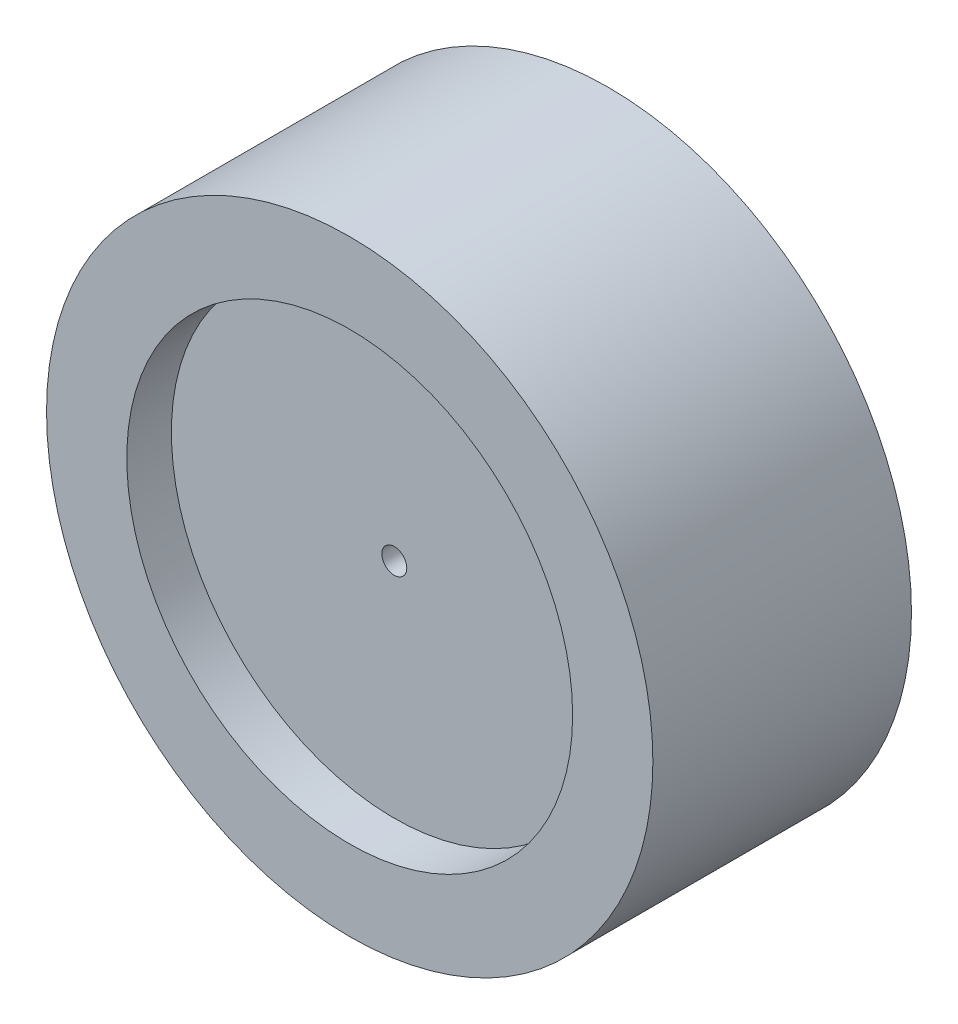
ISO-10303-21;
HEADER;
FILE_DESCRIPTION(('STEP AP214'),'2;1');
FILE_NAME('part.step','',(''),(''),'','','');
FILE_SCHEMA(('AUTOMOTIVE_DESIGN { 1 0 10303 214 1 1 1 1 }'));
ENDSEC;
DATA;
#1=APPLICATION_CONTEXT('core data for automotive mechanical design processes');
#2=APPLICATION_PROTOCOL_DEFINITION('international standard','automotive_design',2000,#1);
#3=PRODUCT_CONTEXT('',#1,'mechanical');
#4=PRODUCT('Part','Part','',(#3));
#5=PRODUCT_RELATED_PRODUCT_CATEGORY('part','',(#4));
#6=PRODUCT_DEFINITION_FORMATION('','',#4);
#7=PRODUCT_DEFINITION_CONTEXT('part definition',#1,'design');
#8=PRODUCT_DEFINITION('design','',#6,#7);
#9=PRODUCT_DEFINITION_SHAPE('','',#8);
#10=(LENGTH_UNIT() NAMED_UNIT(*) SI_UNIT(.MILLI.,.METRE.));
#11=(NAMED_UNIT(*) PLANE_ANGLE_UNIT() SI_UNIT($,.RADIAN.));
#12=(NAMED_UNIT(*) SI_UNIT($,.STERADIAN.) SOLID_ANGLE_UNIT());
#13=UNCERTAINTY_MEASURE_WITH_UNIT(LENGTH_MEASURE(1.E-05),#10,'distance_accuracy_value','');
#14=(GEOMETRIC_REPRESENTATION_CONTEXT(3) GLOBAL_UNCERTAINTY_ASSIGNED_CONTEXT((#13)) GLOBAL_UNIT_ASSIGNED_CONTEXT((#10,
#11,#12)) REPRESENTATION_CONTEXT('',''));
#15=CARTESIAN_POINT('',(0.,0.,0.));
#16=DIRECTION('',(0.,0.,1.));
#17=DIRECTION('',(1.,0.,0.));
#18=AXIS2_PLACEMENT_3D('',#15,#16,#17);
#19=CARTESIAN_POINT('',(0.,0.,29.));
#20=DIRECTION('',(0.,0.,-1.));
#21=DIRECTION('',(-1.,0.,0.));
#22=AXIS2_PLACEMENT_3D('',#19,#20,#21);
#23=CYLINDRICAL_SURFACE('',#22,34.);
#24=CARTESIAN_POINT('',(0.,0.,29.));
#25=DIRECTION('',(0.,0.,1.));
#26=DIRECTION('',(1.,0.,0.));
#27=AXIS2_PLACEMENT_3D('',#24,#25,#26);
#28=CIRCLE('',#27,34.);
#29=CARTESIAN_POINT('',(-34.,0.,29.));
#30=VERTEX_POINT('',#29);
#31=EDGE_CURVE('E11',#30,#30,#28,.T.);
#32=CARTESIAN_POINT('',(0.,0.,0.));
#33=DIRECTION('',(0.,0.,1.));
#34=DIRECTION('',(1.,0.,0.));
#35=AXIS2_PLACEMENT_3D('',#32,#33,#34);
#36=CIRCLE('',#35,34.);
#37=CARTESIAN_POINT('',(-34.,0.,0.));
#38=VERTEX_POINT('',#37);
#39=EDGE_CURVE('E49',#38,#38,#36,.T.);
#40=CARTESIAN_POINT('',(-34.,0.,29.));
#41=CARTESIAN_POINT('',(-34.,0.,28.6979166666667));
#42=CARTESIAN_POINT('',(-34.,0.,28.3958333333333));
#43=CARTESIAN_POINT('',(-34.,0.,27.7916666666667));
#44=CARTESIAN_POINT('',(-34.,0.,27.4895833333333));
#45=CARTESIAN_POINT('',(-34.,0.,26.8854166666667));
#46=CARTESIAN_POINT('',(-34.,0.,26.5833333333333));
#47=CARTESIAN_POINT('',(-34.,0.,25.9791666666667));
#48=CARTESIAN_POINT('',(-34.,0.,25.6770833333333));
#49=CARTESIAN_POINT('',(-34.,0.,25.0729166666667));
#50=CARTESIAN_POINT('',(-34.,0.,24.7708333333333));
#51=CARTESIAN_POINT('',(-34.,0.,24.1666666666667));
#52=CARTESIAN_POINT('',(-34.,0.,23.8645833333333));
#53=CARTESIAN_POINT('',(-34.,0.,23.2604166666667));
#54=CARTESIAN_POINT('',(-34.,0.,22.9583333333333));
#55=CARTESIAN_POINT('',(-34.,0.,22.3541666666667));
#56=CARTESIAN_POINT('',(-34.,0.,22.0520833333333));
#57=CARTESIAN_POINT('',(-34.,0.,21.4479166666667));
#58=CARTESIAN_POINT('',(-34.,0.,21.1458333333333));
#59=CARTESIAN_POINT('',(-34.,0.,20.5416666666667));
#60=CARTESIAN_POINT('',(-34.,0.,20.2395833333333));
#61=CARTESIAN_POINT('',(-34.,0.,19.6354166666667));
#62=CARTESIAN_POINT('',(-34.,0.,19.3333333333333));
#63=CARTESIAN_POINT('',(-34.,0.,18.7291666666667));
#64=CARTESIAN_POINT('',(-34.,0.,18.4270833333333));
#65=CARTESIAN_POINT('',(-34.,0.,17.8229166666667));
#66=CARTESIAN_POINT('',(-34.,0.,17.5208333333333));
#67=CARTESIAN_POINT('',(-34.,0.,16.9166666666667));
#68=CARTESIAN_POINT('',(-34.,0.,16.6145833333333));
#69=CARTESIAN_POINT('',(-34.,0.,16.0104166666667));
#70=CARTESIAN_POINT('',(-34.,0.,15.7083333333333));
#71=CARTESIAN_POINT('',(-34.,0.,15.1041666666667));
#72=CARTESIAN_POINT('',(-34.,0.,14.8020833333333));
#73=CARTESIAN_POINT('',(-34.,0.,14.1979166666667));
#74=CARTESIAN_POINT('',(-34.,0.,13.8958333333333));
#75=CARTESIAN_POINT('',(-34.,0.,13.2916666666667));
#76=CARTESIAN_POINT('',(-34.,0.,12.9895833333333));
#77=CARTESIAN_POINT('',(-34.,0.,12.3854166666667));
#78=CARTESIAN_POINT('',(-34.,0.,12.0833333333333));
#79=CARTESIAN_POINT('',(-34.,0.,11.4791666666667));
#80=CARTESIAN_POINT('',(-34.,0.,11.1770833333333));
#81=CARTESIAN_POINT('',(-34.,0.,10.5729166666667));
#82=CARTESIAN_POINT('',(-34.,0.,10.2708333333333));
#83=CARTESIAN_POINT('',(-34.,0.,9.66666666666667));
#84=CARTESIAN_POINT('',(-34.,0.,9.36458333333333));
#85=CARTESIAN_POINT('',(-34.,0.,8.76041666666667));
#86=CARTESIAN_POINT('',(-34.,0.,8.45833333333333));
#87=CARTESIAN_POINT('',(-34.,0.,7.85416666666667));
#88=CARTESIAN_POINT('',(-34.,0.,7.55208333333333));
#89=CARTESIAN_POINT('',(-34.,0.,6.94791666666667));
#90=CARTESIAN_POINT('',(-34.,0.,6.64583333333333));
#91=CARTESIAN_POINT('',(-34.,0.,6.04166666666667));
#92=CARTESIAN_POINT('',(-34.,0.,5.73958333333333));
#93=CARTESIAN_POINT('',(-34.,0.,5.13541666666667));
#94=CARTESIAN_POINT('',(-34.,0.,4.83333333333333));
#95=CARTESIAN_POINT('',(-34.,0.,4.22916666666667));
#96=CARTESIAN_POINT('',(-34.,0.,3.92708333333333));
#97=CARTESIAN_POINT('',(-34.,0.,3.32291666666667));
#98=CARTESIAN_POINT('',(-34.,0.,3.02083333333333));
#99=CARTESIAN_POINT('',(-34.,0.,2.41666666666667));
#100=CARTESIAN_POINT('',(-34.,0.,2.11458333333333));
#101=CARTESIAN_POINT('',(-34.,0.,1.51041666666667));
#102=CARTESIAN_POINT('',(-34.,0.,1.20833333333333));
#103=CARTESIAN_POINT('',(-34.,0.,0.604166666666667));
#104=CARTESIAN_POINT('',(-34.,0.,0.302083333333333));
#105=CARTESIAN_POINT('',(-34.,0.,0.));
#106=B_SPLINE_CURVE_WITH_KNOTS('',3,(#40,#41,#42,#43,#44,#45,#46,#47,#48,#49,#50,#51,#52,#53,
#54,#55,#56,#57,#58,#59,#60,#61,#62,#63,#64,#65,#66,#67,#68,#69,#70,#71,#72,#73,#74,#75,#76,#77,
#78,#79,#80,#81,#82,#83,#84,#85,#86,#87,#88,#89,#90,#91,#92,#93,#94,#95,#96,#97,#98,#99,#100,
#101,#102,#103,#104,#105),.UNSPECIFIED.,.F.,.F.,(4,2,2,2,2,2,2,2,2,2,2,2,2,2,2,2,2,2,2,2,2,2,2,
2,2,2,2,2,2,2,2,2,4),(0.,0.906249999999997,1.8125,2.71875,3.625,4.53125,5.4375,6.34375,7.25,
8.15625,9.0625,9.96875,10.875,11.78125,12.6875,13.59375,14.5,15.40625,16.3125,17.21875,18.125,
19.03125,19.9375,20.84375,21.75,22.65625,23.5625,24.46875,25.375,26.28125,27.1875,28.09375,29.),.UNSPECIFIED.);
#107=EDGE_CURVE('BSEAM40',#30,#38,#106,.T.);
#108=ORIENTED_EDGE('',*,*,#31,.F.);
#109=ORIENTED_EDGE('',*,*,#39,.T.);
#110=ORIENTED_EDGE('',*,*,#107,.T.);
#111=ORIENTED_EDGE('',*,*,#107,.F.);
#112=EDGE_LOOP('',(#108,#110,#109,#111));
#113=FACE_BOUND('',#112,.T.);
#114=ADVANCED_FACE('F40',(#113),#23,.T.);
#115=CARTESIAN_POINT('',(0.,0.,29.));
#116=DIRECTION('',(0.,0.,1.));
#117=DIRECTION('',(1.,0.,0.));
#118=AXIS2_PLACEMENT_3D('',#115,#116,#117);
#119=PLANE('',#118);
#120=CARTESIAN_POINT('',(0.,0.,29.));
#121=DIRECTION('',(0.,0.,1.));
#122=DIRECTION('',(1.,0.,0.));
#123=AXIS2_PLACEMENT_3D('',#120,#121,#122);
#124=CIRCLE('',#123,25.);
#125=CARTESIAN_POINT('',(25.,0.,29.));
#126=VERTEX_POINT('',#125);
#127=EDGE_CURVE('E170',#126,#126,#124,.T.);
#128=ORIENTED_EDGE('',*,*,#127,.F.);
#129=EDGE_LOOP('',(#128));
#130=FACE_BOUND('',#129,.T.);
#131=ORIENTED_EDGE('',*,*,#31,.T.);
#132=EDGE_LOOP('',(#131));
#133=FACE_BOUND('',#132,.T.);
#134=ADVANCED_FACE('F190',(#130,#133),#119,.T.);
#135=CARTESIAN_POINT('',(0.,0.,0.));
#136=DIRECTION('',(0.,0.,1.));
#137=DIRECTION('',(1.,0.,0.));
#138=AXIS2_PLACEMENT_3D('',#135,#136,#137);
#139=PLANE('',#138);
#140=CARTESIAN_POINT('',(0.,0.,0.));
#141=DIRECTION('',(0.,0.,-1.));
#142=DIRECTION('',(-1.,0.,0.));
#143=AXIS2_PLACEMENT_3D('',#140,#141,#142);
#144=CIRCLE('',#143,25.);
#145=CARTESIAN_POINT('',(-25.,0.,0.));
#146=VERTEX_POINT('',#145);
#147=EDGE_CURVE('E156',#146,#146,#144,.T.);
#148=ORIENTED_EDGE('',*,*,#147,.F.);
#149=EDGE_LOOP('',(#148));
#150=FACE_BOUND('',#149,.T.);
#151=ORIENTED_EDGE('',*,*,#39,.F.);
#152=EDGE_LOOP('',(#151));
#153=FACE_BOUND('',#152,.T.);
#154=ADVANCED_FACE('F187',(#150,#153),#139,.F.);
#155=CARTESIAN_POINT('',(0.,0.,24.));
#156=DIRECTION('',(0.,0.,1.));
#157=DIRECTION('',(1.,0.,0.));
#158=AXIS2_PLACEMENT_3D('',#155,#156,#157);
#159=CYLINDRICAL_SURFACE('',#158,25.);
#160=CARTESIAN_POINT('',(0.,0.,24.));
#161=DIRECTION('',(0.,0.,1.));
#162=DIRECTION('',(1.,0.,0.));
#163=AXIS2_PLACEMENT_3D('',#160,#161,#162);
#164=CIRCLE('',#163,25.);
#165=CARTESIAN_POINT('',(25.,0.,24.));
#166=VERTEX_POINT('',#165);
#167=EDGE_CURVE('E174',#166,#166,#164,.T.);
#168=ORIENTED_EDGE('',*,*,#167,.F.);
#169=EDGE_LOOP('',(#168));
#170=FACE_BOUND('',#169,.T.);
#171=ORIENTED_EDGE('',*,*,#127,.T.);
#172=EDGE_LOOP('',(#171));
#173=FACE_BOUND('',#172,.T.);
#174=ADVANCED_FACE('F189',(#170,#173),#159,.F.);
#175=CARTESIAN_POINT('',(0.,0.,24.));
#176=DIRECTION('',(0.,0.,1.));
#177=DIRECTION('',(1.,0.,0.));
#178=AXIS2_PLACEMENT_3D('',#175,#176,#177);
#179=PLANE('',#178);
#180=CARTESIAN_POINT('',(0.,0.,24.));
#181=DIRECTION('',(0.,0.,1.));
#182=DIRECTION('',(1.,0.,0.));
#183=AXIS2_PLACEMENT_3D('',#180,#181,#182);
#184=CIRCLE('',#183,1.4);
#185=CARTESIAN_POINT('',(1.4,0.,24.));
#186=VERTEX_POINT('',#185);
#187=EDGE_CURVE('E380',#186,#186,#184,.T.);
#188=ORIENTED_EDGE('',*,*,#187,.F.);
#189=EDGE_LOOP('',(#188));
#190=FACE_BOUND('',#189,.T.);
#191=ORIENTED_EDGE('',*,*,#167,.T.);
#192=EDGE_LOOP('',(#191));
#193=FACE_BOUND('',#192,.T.);
#194=ADVANCED_FACE('F196',(#190,#193),#179,.T.);
#195=CARTESIAN_POINT('',(0.,0.,5.));
#196=DIRECTION('',(0.,0.,-1.));
#197=DIRECTION('',(-1.,0.,0.));
#198=AXIS2_PLACEMENT_3D('',#195,#196,#197);
#199=CYLINDRICAL_SURFACE('',#198,25.);
#200=CARTESIAN_POINT('',(0.,0.,5.));
#201=DIRECTION('',(0.,0.,-1.));
#202=DIRECTION('',(-1.,0.,0.));
#203=AXIS2_PLACEMENT_3D('',#200,#201,#202);
#204=CIRCLE('',#203,25.);
#205=CARTESIAN_POINT('',(-25.,0.,5.));
#206=VERTEX_POINT('',#205);
#207=EDGE_CURVE('E166',#206,#206,#204,.T.);
#208=ORIENTED_EDGE('',*,*,#207,.F.);
#209=EDGE_LOOP('',(#208));
#210=FACE_BOUND('',#209,.T.);
#211=ORIENTED_EDGE('',*,*,#147,.T.);
#212=EDGE_LOOP('',(#211));
#213=FACE_BOUND('',#212,.T.);
#214=ADVANCED_FACE('F227',(#210,#213),#199,.F.);
#215=CARTESIAN_POINT('',(0.,0.,5.));
#216=DIRECTION('',(0.,0.,-1.));
#217=DIRECTION('',(-1.,0.,0.));
#218=AXIS2_PLACEMENT_3D('',#215,#216,#217);
#219=PLANE('',#218);
#220=DIRECTION('',(-0.992926916210415,0.118727162287643,0.));
#221=VECTOR('',#220,1.);
#222=CARTESIAN_POINT('',(1.54543416424502,-3.60901185607884,5.));
#223=LINE('',#222,#221);
#224=CARTESIAN_POINT('',(1.54543416424502,-3.60901185607884,5.));
#225=VERTEX_POINT('',#224);
#226=CARTESIAN_POINT('',(-2.35277886780099,-3.14289117415198,5.));
#227=VERTEX_POINT('',#226);
#228=EDGE_CURVE('E57',#225,#227,#223,.T.);
#229=ORIENTED_EDGE('',*,*,#228,.F.);
#230=DIRECTION('',(-0.599284196765544,-0.800536352395741,0.));
#231=VECTOR('',#230,1.);
#232=CARTESIAN_POINT('',(3.89821303204601,-0.466120681926858,5.));
#233=LINE('',#232,#231);
#234=CARTESIAN_POINT('',(3.89821303204601,-0.466120681926858,5.));
#235=VERTEX_POINT('',#234);
#236=EDGE_CURVE('E151',#235,#225,#233,.T.);
#237=ORIENTED_EDGE('',*,*,#236,.F.);
#238=DIRECTION('',(0.393642719444871,-0.919263514683383,0.));
#239=VECTOR('',#238,1.);
#240=CARTESIAN_POINT('',(2.35277886780099,3.14289117415198,5.));
#241=LINE('',#240,#239);
#242=CARTESIAN_POINT('',(2.35277886780099,3.14289117415198,5.));
#243=VERTEX_POINT('',#242);
#244=EDGE_CURVE('E148',#243,#235,#241,.T.);
#245=ORIENTED_EDGE('',*,*,#244,.F.);
#246=DIRECTION('',(0.992926916210415,-0.118727162287643,0.));
#247=VECTOR('',#246,1.);
#248=CARTESIAN_POINT('',(-1.54543416424502,3.60901185607884,5.));
#249=LINE('',#248,#247);
#250=CARTESIAN_POINT('',(-1.54543416424502,3.60901185607884,5.));
#251=VERTEX_POINT('',#250);
#252=EDGE_CURVE('E105',#251,#243,#249,.T.);
#253=ORIENTED_EDGE('',*,*,#252,.F.);
#254=DIRECTION('',(0.599284196765544,0.800536352395741,0.));
#255=VECTOR('',#254,1.);
#256=CARTESIAN_POINT('',(-3.89821303204601,0.466120681926858,5.));
#257=LINE('',#256,#255);
#258=CARTESIAN_POINT('',(-3.89821303204601,0.466120681926858,5.));
#259=VERTEX_POINT('',#258);
#260=EDGE_CURVE('E142',#259,#251,#257,.T.);
#261=ORIENTED_EDGE('',*,*,#260,.F.);
#262=DIRECTION('',(-0.393642719444871,0.919263514683383,0.));
#263=VECTOR('',#262,1.);
#264=CARTESIAN_POINT('',(-2.35277886780099,-3.14289117415198,5.));
#265=LINE('',#264,#263);
#266=EDGE_CURVE('E138',#227,#259,#265,.T.);
#267=ORIENTED_EDGE('',*,*,#266,.F.);
#268=EDGE_LOOP('',(#229,#237,#245,#253,#261,#267));
#269=FACE_BOUND('',#268,.T.);
#270=ORIENTED_EDGE('',*,*,#207,.T.);
#271=EDGE_LOOP('',(#270));
#272=FACE_BOUND('',#271,.T.);
#273=ADVANCED_FACE('F237',(#269,#272),#219,.T.);
#274=CARTESIAN_POINT('',(1.54543416424502,-3.60901185607884,15.));
#275=DIRECTION('',(-0.118727162287643,-0.992926916210415,0.));
#276=DIRECTION('',(0.992926916210415,-0.118727162287643,0.));
#277=AXIS2_PLACEMENT_3D('',#274,#275,#276);
#278=PLANE('',#277);
#279=ORIENTED_EDGE('',*,*,#228,.T.);
#280=DIRECTION('',(0.,0.,-1.));
#281=VECTOR('',#280,1.);
#282=CARTESIAN_POINT('',(-2.35277886780099,-3.14289117415198,15.));
#283=LINE('',#282,#281);
#284=CARTESIAN_POINT('',(-2.35277886780099,-3.14289117415198,15.));
#285=VERTEX_POINT('',#284);
#286=EDGE_CURVE('E87',#285,#227,#283,.T.);
#287=ORIENTED_EDGE('',*,*,#286,.F.);
#288=DIRECTION('',(-0.992926916210415,0.118727162287643,0.));
#289=VECTOR('',#288,1.);
#290=CARTESIAN_POINT('',(1.54543416424502,-3.60901185607884,15.));
#291=LINE('',#290,#289);
#292=CARTESIAN_POINT('',(1.54543416424502,-3.60901185607884,15.));
#293=VERTEX_POINT('',#292);
#294=EDGE_CURVE('E153',#293,#285,#291,.T.);
#295=ORIENTED_EDGE('',*,*,#294,.F.);
#296=DIRECTION('',(0.,0.,-1.));
#297=VECTOR('',#296,1.);
#298=CARTESIAN_POINT('',(1.54543416424502,-3.60901185607884,15.));
#299=LINE('',#298,#297);
#300=EDGE_CURVE('E65',#293,#225,#299,.T.);
#301=ORIENTED_EDGE('',*,*,#300,.T.);
#302=EDGE_LOOP('',(#279,#287,#295,#301));
#303=FACE_BOUND('',#302,.T.);
#304=ADVANCED_FACE('F246',(#303),#278,.F.);
#305=CARTESIAN_POINT('',(3.89821303204601,-0.466120681926858,15.));
#306=DIRECTION('',(0.800536352395741,-0.599284196765544,0.));
#307=DIRECTION('',(0.599284196765544,0.800536352395741,0.));
#308=AXIS2_PLACEMENT_3D('',#305,#306,#307);
#309=PLANE('',#308);
#310=ORIENTED_EDGE('',*,*,#236,.T.);
#311=ORIENTED_EDGE('',*,*,#300,.F.);
#312=DIRECTION('',(-0.599284196765544,-0.800536352395741,0.));
#313=VECTOR('',#312,1.);
#314=CARTESIAN_POINT('',(3.89821303204601,-0.466120681926858,15.));
#315=LINE('',#314,#313);
#316=CARTESIAN_POINT('',(3.89821303204601,-0.466120681926858,15.));
#317=VERTEX_POINT('',#316);
#318=EDGE_CURVE('E119',#317,#293,#315,.T.);
#319=ORIENTED_EDGE('',*,*,#318,.F.);
#320=DIRECTION('',(0.,0.,-1.));
#321=VECTOR('',#320,1.);
#322=CARTESIAN_POINT('',(3.89821303204601,-0.466120681926858,15.));
#323=LINE('',#322,#321);
#324=EDGE_CURVE('E110',#317,#235,#323,.T.);
#325=ORIENTED_EDGE('',*,*,#324,.T.);
#326=EDGE_LOOP('',(#310,#311,#319,#325));
#327=FACE_BOUND('',#326,.T.);
#328=ADVANCED_FACE('F255',(#327),#309,.F.);
#329=CARTESIAN_POINT('',(2.35277886780099,3.14289117415198,15.));
#330=DIRECTION('',(0.919263514683383,0.393642719444871,0.));
#331=DIRECTION('',(-0.393642719444871,0.919263514683383,0.));
#332=AXIS2_PLACEMENT_3D('',#329,#330,#331);
#333=PLANE('',#332);
#334=ORIENTED_EDGE('',*,*,#244,.T.);
#335=ORIENTED_EDGE('',*,*,#324,.F.);
#336=DIRECTION('',(0.393642719444871,-0.919263514683383,0.));
#337=VECTOR('',#336,1.);
#338=CARTESIAN_POINT('',(2.35277886780099,3.14289117415198,15.));
#339=LINE('',#338,#337);
#340=CARTESIAN_POINT('',(2.35277886780099,3.14289117415198,15.));
#341=VERTEX_POINT('',#340);
#342=EDGE_CURVE('E114',#341,#317,#339,.T.);
#343=ORIENTED_EDGE('',*,*,#342,.F.);
#344=DIRECTION('',(0.,0.,-1.));
#345=VECTOR('',#344,1.);
#346=CARTESIAN_POINT('',(2.35277886780099,3.14289117415198,15.));
#347=LINE('',#346,#345);
#348=EDGE_CURVE('E98',#341,#243,#347,.T.);
#349=ORIENTED_EDGE('',*,*,#348,.T.);
#350=EDGE_LOOP('',(#334,#335,#343,#349));
#351=FACE_BOUND('',#350,.T.);
#352=ADVANCED_FACE('F115',(#351),#333,.F.);
#353=CARTESIAN_POINT('',(-1.54543416424502,3.60901185607884,15.));
#354=DIRECTION('',(0.118727162287643,0.992926916210415,0.));
#355=DIRECTION('',(-0.992926916210415,0.118727162287643,0.));
#356=AXIS2_PLACEMENT_3D('',#353,#354,#355);
#357=PLANE('',#356);
#358=ORIENTED_EDGE('',*,*,#252,.T.);
#359=ORIENTED_EDGE('',*,*,#348,.F.);
#360=DIRECTION('',(0.992926916210415,-0.118727162287643,0.));
#361=VECTOR('',#360,1.);
#362=CARTESIAN_POINT('',(-1.54543416424502,3.60901185607884,15.));
#363=LINE('',#362,#361);
#364=CARTESIAN_POINT('',(-1.54543416424502,3.60901185607884,15.));
#365=VERTEX_POINT('',#364);
#366=EDGE_CURVE('E102',#365,#341,#363,.T.);
#367=ORIENTED_EDGE('',*,*,#366,.F.);
#368=DIRECTION('',(0.,0.,-1.));
#369=VECTOR('',#368,1.);
#370=CARTESIAN_POINT('',(-1.54543416424502,3.60901185607884,15.));
#371=LINE('',#370,#369);
#372=EDGE_CURVE('E111',#365,#251,#371,.T.);
#373=ORIENTED_EDGE('',*,*,#372,.T.);
#374=EDGE_LOOP('',(#358,#359,#367,#373));
#375=FACE_BOUND('',#374,.T.);
#376=ADVANCED_FACE('F100',(#375),#357,.F.);
#377=CARTESIAN_POINT('',(-3.89821303204601,0.466120681926858,15.));
#378=DIRECTION('',(-0.800536352395741,0.599284196765544,0.));
#379=DIRECTION('',(-0.599284196765544,-0.800536352395741,0.));
#380=AXIS2_PLACEMENT_3D('',#377,#378,#379);
#381=PLANE('',#380);
#382=ORIENTED_EDGE('',*,*,#260,.T.);
#383=ORIENTED_EDGE('',*,*,#372,.F.);
#384=DIRECTION('',(0.599284196765544,0.800536352395741,0.));
#385=VECTOR('',#384,1.);
#386=CARTESIAN_POINT('',(-3.89821303204601,0.466120681926858,15.));
#387=LINE('',#386,#385);
#388=CARTESIAN_POINT('',(-3.89821303204601,0.466120681926858,15.));
#389=VERTEX_POINT('',#388);
#390=EDGE_CURVE('E125',#389,#365,#387,.T.);
#391=ORIENTED_EDGE('',*,*,#390,.F.);
#392=DIRECTION('',(0.,0.,-1.));
#393=VECTOR('',#392,1.);
#394=CARTESIAN_POINT('',(-3.89821303204601,0.466120681926858,15.));
#395=LINE('',#394,#393);
#396=EDGE_CURVE('E161',#389,#259,#395,.T.);
#397=ORIENTED_EDGE('',*,*,#396,.T.);
#398=EDGE_LOOP('',(#382,#383,#391,#397));
#399=FACE_BOUND('',#398,.T.);
#400=ADVANCED_FACE('F277',(#399),#381,.F.);
#401=CARTESIAN_POINT('',(-2.35277886780099,-3.14289117415198,15.));
#402=DIRECTION('',(-0.919263514683383,-0.393642719444871,0.));
#403=DIRECTION('',(0.393642719444871,-0.919263514683383,0.));
#404=AXIS2_PLACEMENT_3D('',#401,#402,#403);
#405=PLANE('',#404);
#406=ORIENTED_EDGE('',*,*,#266,.T.);
#407=ORIENTED_EDGE('',*,*,#396,.F.);
#408=DIRECTION('',(-0.393642719444871,0.919263514683383,0.));
#409=VECTOR('',#408,1.);
#410=CARTESIAN_POINT('',(-2.35277886780099,-3.14289117415198,15.));
#411=LINE('',#410,#409);
#412=EDGE_CURVE('E130',#285,#389,#411,.T.);
#413=ORIENTED_EDGE('',*,*,#412,.F.);
#414=ORIENTED_EDGE('',*,*,#286,.T.);
#415=EDGE_LOOP('',(#406,#407,#413,#414));
#416=FACE_BOUND('',#415,.T.);
#417=ADVANCED_FACE('F285',(#416),#405,.F.);
#418=CARTESIAN_POINT('',(0.,0.,15.));
#419=DIRECTION('',(0.,0.,-1.));
#420=DIRECTION('',(-1.,0.,0.));
#421=AXIS2_PLACEMENT_3D('',#418,#419,#420);
#422=PLANE('',#421);
#423=CARTESIAN_POINT('',(0.,0.,15.));
#424=DIRECTION('',(0.,0.,-1.));
#425=DIRECTION('',(-1.,0.,0.));
#426=AXIS2_PLACEMENT_3D('',#423,#424,#425);
#427=CIRCLE('',#426,1.4);
#428=CARTESIAN_POINT('',(-1.4,0.,15.));
#429=VERTEX_POINT('',#428);
#430=EDGE_CURVE('E43',#429,#429,#427,.T.);
#431=ORIENTED_EDGE('',*,*,#430,.F.);
#432=EDGE_LOOP('',(#431));
#433=FACE_BOUND('',#432,.T.);
#434=ORIENTED_EDGE('',*,*,#294,.T.);
#435=ORIENTED_EDGE('',*,*,#412,.T.);
#436=ORIENTED_EDGE('',*,*,#390,.T.);
#437=ORIENTED_EDGE('',*,*,#366,.T.);
#438=ORIENTED_EDGE('',*,*,#342,.T.);
#439=ORIENTED_EDGE('',*,*,#318,.T.);
#440=EDGE_LOOP('',(#434,#435,#436,#437,#438,#439));
#441=FACE_BOUND('',#440,.T.);
#442=ADVANCED_FACE('F122',(#433,#441),#422,.T.);
#443=CARTESIAN_POINT('',(0.,0.,0.));
#444=DIRECTION('',(0.,0.,1.));
#445=DIRECTION('',(1.,0.,0.));
#446=AXIS2_PLACEMENT_3D('',#443,#444,#445);
#447=CYLINDRICAL_SURFACE('',#446,1.4);
#448=ORIENTED_EDGE('',*,*,#430,.T.);
#449=EDGE_LOOP('',(#448));
#450=FACE_BOUND('',#449,.T.);
#451=ORIENTED_EDGE('',*,*,#187,.T.);
#452=EDGE_LOOP('',(#451));
#453=FACE_BOUND('',#452,.T.);
#454=ADVANCED_FACE('F300',(#450,#453),#447,.F.);
#455=CLOSED_SHELL('',(#114,#134,#154,#174,#194,#214,#273,#304,#328,#352,#376,#400,#417,#442,#454));
#456=MANIFOLD_SOLID_BREP('B2',#455);
#457=ADVANCED_BREP_SHAPE_REPRESENTATION('',(#18,#456),#14);
#458=SHAPE_DEFINITION_REPRESENTATION(#9,#457);
ENDSEC;
END-ISO-10303-21;
